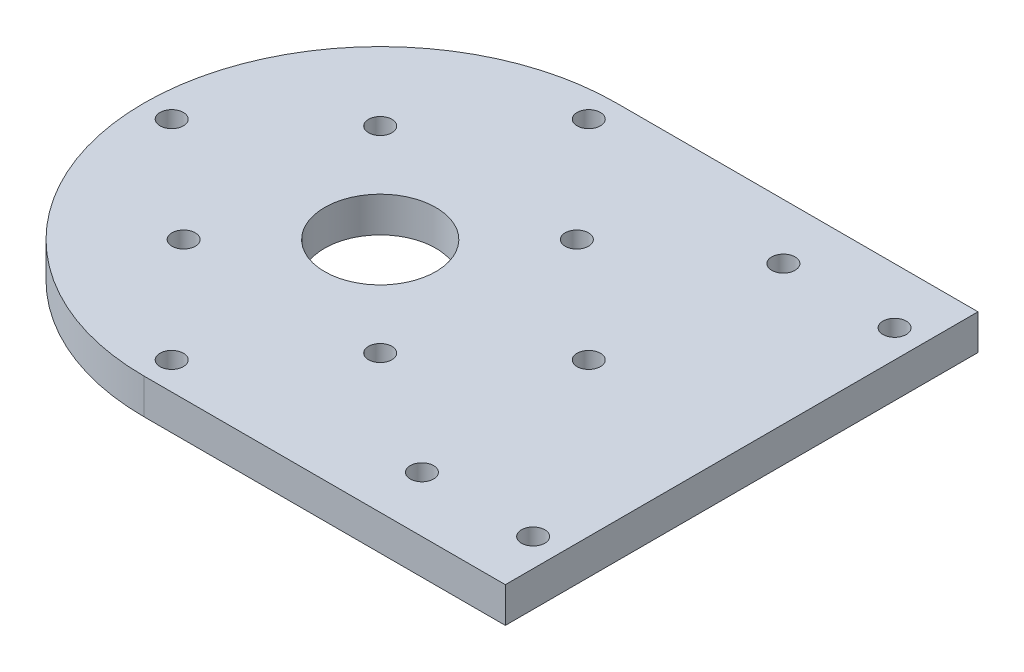
ISO-10303-21;
HEADER;
FILE_DESCRIPTION(('STEP AP214'),'2;1');
FILE_NAME('part.step','',(''),(''),'','','');
FILE_SCHEMA(('AUTOMOTIVE_DESIGN { 1 0 10303 214 1 1 1 1 }'));
ENDSEC;
DATA;
#1=APPLICATION_CONTEXT('core data for automotive mechanical design processes');
#2=APPLICATION_PROTOCOL_DEFINITION('international standard','automotive_design',2000,#1);
#3=PRODUCT_CONTEXT('',#1,'mechanical');
#4=PRODUCT('Part','Part','',(#3));
#5=PRODUCT_RELATED_PRODUCT_CATEGORY('part','',(#4));
#6=PRODUCT_DEFINITION_FORMATION('','',#4);
#7=PRODUCT_DEFINITION_CONTEXT('part definition',#1,'design');
#8=PRODUCT_DEFINITION('design','',#6,#7);
#9=PRODUCT_DEFINITION_SHAPE('','',#8);
#10=(LENGTH_UNIT() NAMED_UNIT(*) SI_UNIT(.MILLI.,.METRE.));
#11=(NAMED_UNIT(*) PLANE_ANGLE_UNIT() SI_UNIT($,.RADIAN.));
#12=(NAMED_UNIT(*) SI_UNIT($,.STERADIAN.) SOLID_ANGLE_UNIT());
#13=UNCERTAINTY_MEASURE_WITH_UNIT(LENGTH_MEASURE(1.E-05),#10,'distance_accuracy_value','');
#14=(GEOMETRIC_REPRESENTATION_CONTEXT(3) GLOBAL_UNCERTAINTY_ASSIGNED_CONTEXT((#13)) GLOBAL_UNIT_ASSIGNED_CONTEXT((#10,
#11,#12)) REPRESENTATION_CONTEXT('',''));
#15=CARTESIAN_POINT('',(0.,0.,0.));
#16=DIRECTION('',(0.,0.,1.));
#17=DIRECTION('',(1.,0.,0.));
#18=AXIS2_PLACEMENT_3D('',#15,#16,#17);
#19=CARTESIAN_POINT('',(0.,-6.35,0.));
#20=DIRECTION('',(0.,1.,0.));
#21=DIRECTION('',(0.,0.,1.));
#22=AXIS2_PLACEMENT_3D('',#19,#20,#21);
#23=CYLINDRICAL_SURFACE('',#22,42.5);
#24=CARTESIAN_POINT('',(0.,0.,0.));
#25=DIRECTION('',(0.,1.,0.));
#26=DIRECTION('',(0.,0.,1.));
#27=AXIS2_PLACEMENT_3D('',#24,#25,#26);
#28=CIRCLE('',#27,42.5);
#29=CARTESIAN_POINT('',(0.,0.,-42.5));
#30=VERTEX_POINT('',#29);
#31=CARTESIAN_POINT('',(0.,0.,42.5));
#32=VERTEX_POINT('',#31);
#33=EDGE_CURVE('E143',#30,#32,#28,.T.);
#34=ORIENTED_EDGE('',*,*,#33,.F.);
#35=DIRECTION('',(0.,1.,0.));
#36=VECTOR('',#35,1.);
#37=CARTESIAN_POINT('',(0.,-6.35,-42.5));
#38=LINE('',#37,#36);
#39=CARTESIAN_POINT('',(0.,-6.35,-42.5));
#40=VERTEX_POINT('',#39);
#41=EDGE_CURVE('E11',#40,#30,#38,.T.);
#42=ORIENTED_EDGE('',*,*,#41,.F.);
#43=CARTESIAN_POINT('',(0.,-6.35,0.));
#44=DIRECTION('',(0.,1.,0.));
#45=DIRECTION('',(0.,0.,1.));
#46=AXIS2_PLACEMENT_3D('',#43,#44,#45);
#47=CIRCLE('',#46,42.5);
#48=CARTESIAN_POINT('',(0.,-6.35,42.5));
#49=VERTEX_POINT('',#48);
#50=EDGE_CURVE('E97',#40,#49,#47,.T.);
#51=ORIENTED_EDGE('',*,*,#50,.T.);
#52=DIRECTION('',(0.,1.,0.));
#53=VECTOR('',#52,1.);
#54=CARTESIAN_POINT('',(0.,-6.35,42.5));
#55=LINE('',#54,#53);
#56=EDGE_CURVE('E39',#49,#32,#55,.T.);
#57=ORIENTED_EDGE('',*,*,#56,.T.);
#58=EDGE_LOOP('',(#34,#42,#51,#57));
#59=FACE_BOUND('',#58,.T.);
#60=ADVANCED_FACE('F35',(#59),#23,.T.);
#61=CARTESIAN_POINT('',(0.,-6.35,-42.5));
#62=DIRECTION('',(0.,0.,1.));
#63=DIRECTION('',(1.,0.,0.));
#64=AXIS2_PLACEMENT_3D('',#61,#62,#63);
#65=PLANE('',#64);
#66=DIRECTION('',(1.,0.,0.));
#67=VECTOR('',#66,1.);
#68=CARTESIAN_POINT('',(0.,0.,-42.5));
#69=LINE('',#68,#67);
#70=CARTESIAN_POINT('',(65.,0.,-42.5));
#71=VERTEX_POINT('',#70);
#72=EDGE_CURVE('E149',#30,#71,#69,.T.);
#73=ORIENTED_EDGE('',*,*,#72,.T.);
#74=DIRECTION('',(0.,1.,0.));
#75=VECTOR('',#74,1.);
#76=CARTESIAN_POINT('',(65.,-6.35,-42.5));
#77=LINE('',#76,#75);
#78=CARTESIAN_POINT('',(65.,-6.35,-42.5));
#79=VERTEX_POINT('',#78);
#80=EDGE_CURVE('E45',#79,#71,#77,.T.);
#81=ORIENTED_EDGE('',*,*,#80,.F.);
#82=DIRECTION('',(1.,0.,0.));
#83=VECTOR('',#82,1.);
#84=CARTESIAN_POINT('',(0.,-6.35,-42.5));
#85=LINE('',#84,#83);
#86=EDGE_CURVE('E90',#40,#79,#85,.T.);
#87=ORIENTED_EDGE('',*,*,#86,.F.);
#88=ORIENTED_EDGE('',*,*,#41,.T.);
#89=EDGE_LOOP('',(#73,#81,#87,#88));
#90=FACE_BOUND('',#89,.T.);
#91=ADVANCED_FACE('F164',(#90),#65,.F.);
#92=CARTESIAN_POINT('',(65.,-6.35,0.));
#93=DIRECTION('',(-1.,0.,0.));
#94=DIRECTION('',(0.,0.,1.));
#95=AXIS2_PLACEMENT_3D('',#92,#93,#94);
#96=PLANE('',#95);
#97=DIRECTION('',(0.,0.,1.));
#98=VECTOR('',#97,1.);
#99=CARTESIAN_POINT('',(65.,0.,0.));
#100=LINE('',#99,#98);
#101=CARTESIAN_POINT('',(65.,0.,42.5));
#102=VERTEX_POINT('',#101);
#103=EDGE_CURVE('E70',#71,#102,#100,.T.);
#104=ORIENTED_EDGE('',*,*,#103,.T.);
#105=DIRECTION('',(0.,1.,0.));
#106=VECTOR('',#105,1.);
#107=CARTESIAN_POINT('',(65.,-6.35,42.5));
#108=LINE('',#107,#106);
#109=CARTESIAN_POINT('',(65.,-6.35,42.5));
#110=VERTEX_POINT('',#109);
#111=EDGE_CURVE('E94',#110,#102,#108,.T.);
#112=ORIENTED_EDGE('',*,*,#111,.F.);
#113=DIRECTION('',(0.,0.,1.));
#114=VECTOR('',#113,1.);
#115=CARTESIAN_POINT('',(65.,-6.35,0.));
#116=LINE('',#115,#114);
#117=EDGE_CURVE('E84',#79,#110,#116,.T.);
#118=ORIENTED_EDGE('',*,*,#117,.F.);
#119=ORIENTED_EDGE('',*,*,#80,.T.);
#120=EDGE_LOOP('',(#104,#112,#118,#119));
#121=FACE_BOUND('',#120,.T.);
#122=ADVANCED_FACE('F95',(#121),#96,.F.);
#123=CARTESIAN_POINT('',(60.,-6.35,-32.5));
#124=DIRECTION('',(0.,1.,0.));
#125=DIRECTION('',(0.,0.,1.));
#126=AXIS2_PLACEMENT_3D('',#123,#124,#125);
#127=CYLINDRICAL_SURFACE('',#126,2.10000000000001);
#128=CARTESIAN_POINT('',(60.,-6.35,-32.5));
#129=DIRECTION('',(0.,1.,0.));
#130=DIRECTION('',(0.,0.,1.));
#131=AXIS2_PLACEMENT_3D('',#128,#129,#130);
#132=CIRCLE('',#131,2.10000000000001);
#133=CARTESIAN_POINT('',(60.,-6.35,-30.4));
#134=VERTEX_POINT('',#133);
#135=EDGE_CURVE('E110',#134,#134,#132,.T.);
#136=ORIENTED_EDGE('',*,*,#135,.F.);
#137=EDGE_LOOP('',(#136));
#138=FACE_BOUND('',#137,.T.);
#139=CARTESIAN_POINT('',(60.,0.,-32.5));
#140=DIRECTION('',(0.,1.,0.));
#141=DIRECTION('',(0.,0.,1.));
#142=AXIS2_PLACEMENT_3D('',#139,#140,#141);
#143=CIRCLE('',#142,2.10000000000001);
#144=CARTESIAN_POINT('',(60.,0.,-30.4));
#145=VERTEX_POINT('',#144);
#146=EDGE_CURVE('E157',#145,#145,#143,.T.);
#147=ORIENTED_EDGE('',*,*,#146,.T.);
#148=EDGE_LOOP('',(#147));
#149=FACE_BOUND('',#148,.T.);
#150=ADVANCED_FACE('F251',(#138,#149),#127,.F.);
#151=CARTESIAN_POINT('',(40.,-6.35,32.5));
#152=DIRECTION('',(0.,1.,0.));
#153=DIRECTION('',(0.,0.,1.));
#154=AXIS2_PLACEMENT_3D('',#151,#152,#153);
#155=CYLINDRICAL_SURFACE('',#154,2.1);
#156=CARTESIAN_POINT('',(40.,-6.35,32.5));
#157=DIRECTION('',(0.,1.,0.));
#158=DIRECTION('',(0.,0.,1.));
#159=AXIS2_PLACEMENT_3D('',#156,#157,#158);
#160=CIRCLE('',#159,2.1);
#161=CARTESIAN_POINT('',(40.,-6.35,34.6));
#162=VERTEX_POINT('',#161);
#163=EDGE_CURVE('E107',#162,#162,#160,.T.);
#164=ORIENTED_EDGE('',*,*,#163,.F.);
#165=EDGE_LOOP('',(#164));
#166=FACE_BOUND('',#165,.T.);
#167=CARTESIAN_POINT('',(40.,0.,32.5));
#168=DIRECTION('',(0.,1.,0.));
#169=DIRECTION('',(0.,0.,1.));
#170=AXIS2_PLACEMENT_3D('',#167,#168,#169);
#171=CIRCLE('',#170,2.1);
#172=CARTESIAN_POINT('',(40.,0.,34.6));
#173=VERTEX_POINT('',#172);
#174=EDGE_CURVE('E154',#173,#173,#171,.T.);
#175=ORIENTED_EDGE('',*,*,#174,.T.);
#176=EDGE_LOOP('',(#175));
#177=FACE_BOUND('',#176,.T.);
#178=ADVANCED_FACE('F254',(#166,#177),#155,.F.);
#179=CARTESIAN_POINT('',(60.,-6.35,32.5));
#180=DIRECTION('',(0.,1.,0.));
#181=DIRECTION('',(0.,0.,1.));
#182=AXIS2_PLACEMENT_3D('',#179,#180,#181);
#183=CYLINDRICAL_SURFACE('',#182,2.1);
#184=CARTESIAN_POINT('',(60.,-6.35,32.5));
#185=DIRECTION('',(0.,1.,0.));
#186=DIRECTION('',(0.,0.,1.));
#187=AXIS2_PLACEMENT_3D('',#184,#185,#186);
#188=CIRCLE('',#187,2.1);
#189=CARTESIAN_POINT('',(60.,-6.35,34.6));
#190=VERTEX_POINT('',#189);
#191=EDGE_CURVE('E104',#190,#190,#188,.T.);
#192=ORIENTED_EDGE('',*,*,#191,.F.);
#193=EDGE_LOOP('',(#192));
#194=FACE_BOUND('',#193,.T.);
#195=CARTESIAN_POINT('',(60.,0.,32.5));
#196=DIRECTION('',(0.,1.,0.));
#197=DIRECTION('',(0.,0.,1.));
#198=AXIS2_PLACEMENT_3D('',#195,#196,#197);
#199=CIRCLE('',#198,2.1);
#200=CARTESIAN_POINT('',(60.,0.,34.6));
#201=VERTEX_POINT('',#200);
#202=EDGE_CURVE('E151',#201,#201,#199,.T.);
#203=ORIENTED_EDGE('',*,*,#202,.T.);
#204=EDGE_LOOP('',(#203));
#205=FACE_BOUND('',#204,.T.);
#206=ADVANCED_FACE('F258',(#194,#205),#183,.F.);
#207=CARTESIAN_POINT('',(0.,-6.35,42.5));
#208=DIRECTION('',(0.,0.,1.));
#209=DIRECTION('',(1.,0.,0.));
#210=AXIS2_PLACEMENT_3D('',#207,#208,#209);
#211=PLANE('',#210);
#212=DIRECTION('',(1.,0.,0.));
#213=VECTOR('',#212,1.);
#214=CARTESIAN_POINT('',(0.,0.,42.5));
#215=LINE('',#214,#213);
#216=EDGE_CURVE('E146',#32,#102,#215,.T.);
#217=ORIENTED_EDGE('',*,*,#216,.F.);
#218=ORIENTED_EDGE('',*,*,#56,.F.);
#219=DIRECTION('',(1.,0.,0.));
#220=VECTOR('',#219,1.);
#221=CARTESIAN_POINT('',(0.,-6.35,42.5));
#222=LINE('',#221,#220);
#223=EDGE_CURVE('E89',#49,#110,#222,.T.);
#224=ORIENTED_EDGE('',*,*,#223,.T.);
#225=ORIENTED_EDGE('',*,*,#111,.T.);
#226=EDGE_LOOP('',(#217,#218,#224,#225));
#227=FACE_BOUND('',#226,.T.);
#228=ADVANCED_FACE('F96',(#227),#211,.T.);
#229=CARTESIAN_POINT('',(0.,-6.35,0.));
#230=DIRECTION('',(0.,1.,0.));
#231=DIRECTION('',(0.,0.,1.));
#232=AXIS2_PLACEMENT_3D('',#229,#230,#231);
#233=CYLINDRICAL_SURFACE('',#232,9.99999999999998);
#234=CARTESIAN_POINT('',(0.,-6.35,0.));
#235=DIRECTION('',(0.,1.,0.));
#236=DIRECTION('',(0.,0.,1.));
#237=AXIS2_PLACEMENT_3D('',#234,#235,#236);
#238=CIRCLE('',#237,9.99999999999998);
#239=CARTESIAN_POINT('',(0.,-6.35,9.99999999999998));
#240=VERTEX_POINT('',#239);
#241=EDGE_CURVE('E99',#240,#240,#238,.T.);
#242=ORIENTED_EDGE('',*,*,#241,.F.);
#243=EDGE_LOOP('',(#242));
#244=FACE_BOUND('',#243,.T.);
#245=CARTESIAN_POINT('',(0.,0.,0.));
#246=DIRECTION('',(0.,1.,0.));
#247=DIRECTION('',(0.,0.,1.));
#248=AXIS2_PLACEMENT_3D('',#245,#246,#247);
#249=CIRCLE('',#248,9.99999999999998);
#250=CARTESIAN_POINT('',(0.,0.,9.99999999999998));
#251=VERTEX_POINT('',#250);
#252=EDGE_CURVE('E140',#251,#251,#249,.T.);
#253=ORIENTED_EDGE('',*,*,#252,.T.);
#254=EDGE_LOOP('',(#253));
#255=FACE_BOUND('',#254,.T.);
#256=ADVANCED_FACE('F176',(#244,#255),#233,.F.);
#257=CARTESIAN_POINT('',(-37.5,-6.35,0.));
#258=DIRECTION('',(0.,1.,0.));
#259=DIRECTION('',(0.,0.,1.));
#260=AXIS2_PLACEMENT_3D('',#257,#258,#259);
#261=CYLINDRICAL_SURFACE('',#260,2.09999999999999);
#262=CARTESIAN_POINT('',(-37.5,-6.35,0.));
#263=DIRECTION('',(0.,1.,0.));
#264=DIRECTION('',(0.,0.,1.));
#265=AXIS2_PLACEMENT_3D('',#262,#263,#264);
#266=CIRCLE('',#265,2.09999999999999);
#267=CARTESIAN_POINT('',(-37.5,-6.35,2.09999999999999));
#268=VERTEX_POINT('',#267);
#269=EDGE_CURVE('E430',#268,#268,#266,.T.);
#270=ORIENTED_EDGE('',*,*,#269,.F.);
#271=EDGE_LOOP('',(#270));
#272=FACE_BOUND('',#271,.T.);
#273=CARTESIAN_POINT('',(-37.5,0.,0.));
#274=DIRECTION('',(0.,1.,0.));
#275=DIRECTION('',(0.,0.,1.));
#276=AXIS2_PLACEMENT_3D('',#273,#274,#275);
#277=CIRCLE('',#276,2.09999999999999);
#278=CARTESIAN_POINT('',(-37.5,0.,2.09999999999999));
#279=VERTEX_POINT('',#278);
#280=EDGE_CURVE('E137',#279,#279,#277,.T.);
#281=ORIENTED_EDGE('',*,*,#280,.T.);
#282=EDGE_LOOP('',(#281));
#283=FACE_BOUND('',#282,.T.);
#284=ADVANCED_FACE('F179',(#272,#283),#261,.F.);
#285=CARTESIAN_POINT('',(0.,-6.35,-37.5));
#286=DIRECTION('',(0.,1.,0.));
#287=DIRECTION('',(0.,0.,1.));
#288=AXIS2_PLACEMENT_3D('',#285,#286,#287);
#289=CYLINDRICAL_SURFACE('',#288,2.09999999999999);
#290=CARTESIAN_POINT('',(0.,-6.35,-37.5));
#291=DIRECTION('',(0.,1.,0.));
#292=DIRECTION('',(0.,0.,1.));
#293=AXIS2_PLACEMENT_3D('',#290,#291,#292);
#294=CIRCLE('',#293,2.09999999999999);
#295=CARTESIAN_POINT('',(0.,-6.35,-35.4));
#296=VERTEX_POINT('',#295);
#297=EDGE_CURVE('E426',#296,#296,#294,.T.);
#298=ORIENTED_EDGE('',*,*,#297,.F.);
#299=EDGE_LOOP('',(#298));
#300=FACE_BOUND('',#299,.T.);
#301=CARTESIAN_POINT('',(0.,0.,-37.5));
#302=DIRECTION('',(0.,1.,0.));
#303=DIRECTION('',(0.,0.,1.));
#304=AXIS2_PLACEMENT_3D('',#301,#302,#303);
#305=CIRCLE('',#304,2.09999999999999);
#306=CARTESIAN_POINT('',(0.,0.,-35.4));
#307=VERTEX_POINT('',#306);
#308=EDGE_CURVE('E134',#307,#307,#305,.T.);
#309=ORIENTED_EDGE('',*,*,#308,.T.);
#310=EDGE_LOOP('',(#309));
#311=FACE_BOUND('',#310,.T.);
#312=ADVANCED_FACE('F183',(#300,#311),#289,.F.);
#313=CARTESIAN_POINT('',(0.,-6.35,37.5));
#314=DIRECTION('',(0.,1.,0.));
#315=DIRECTION('',(0.,0.,1.));
#316=AXIS2_PLACEMENT_3D('',#313,#314,#315);
#317=CYLINDRICAL_SURFACE('',#316,2.09999999999999);
#318=CARTESIAN_POINT('',(0.,-6.35,37.5));
#319=DIRECTION('',(0.,1.,0.));
#320=DIRECTION('',(0.,0.,1.));
#321=AXIS2_PLACEMENT_3D('',#318,#319,#320);
#322=CIRCLE('',#321,2.09999999999999);
#323=CARTESIAN_POINT('',(0.,-6.35,39.6));
#324=VERTEX_POINT('',#323);
#325=EDGE_CURVE('E422',#324,#324,#322,.T.);
#326=ORIENTED_EDGE('',*,*,#325,.F.);
#327=EDGE_LOOP('',(#326));
#328=FACE_BOUND('',#327,.T.);
#329=CARTESIAN_POINT('',(0.,0.,37.5));
#330=DIRECTION('',(0.,1.,0.));
#331=DIRECTION('',(0.,0.,1.));
#332=AXIS2_PLACEMENT_3D('',#329,#330,#331);
#333=CIRCLE('',#332,2.09999999999999);
#334=CARTESIAN_POINT('',(0.,0.,39.6));
#335=VERTEX_POINT('',#334);
#336=EDGE_CURVE('E131',#335,#335,#333,.T.);
#337=ORIENTED_EDGE('',*,*,#336,.T.);
#338=EDGE_LOOP('',(#337));
#339=FACE_BOUND('',#338,.T.);
#340=ADVANCED_FACE('F187',(#328,#339),#317,.F.);
#341=CARTESIAN_POINT('',(37.5,-6.35,0.));
#342=DIRECTION('',(0.,1.,0.));
#343=DIRECTION('',(0.,0.,1.));
#344=AXIS2_PLACEMENT_3D('',#341,#342,#343);
#345=CYLINDRICAL_SURFACE('',#344,2.1);
#346=CARTESIAN_POINT('',(37.5,-6.35,0.));
#347=DIRECTION('',(0.,1.,0.));
#348=DIRECTION('',(0.,0.,1.));
#349=AXIS2_PLACEMENT_3D('',#346,#347,#348);
#350=CIRCLE('',#349,2.1);
#351=CARTESIAN_POINT('',(37.5,-6.35,2.1));
#352=VERTEX_POINT('',#351);
#353=EDGE_CURVE('E418',#352,#352,#350,.T.);
#354=ORIENTED_EDGE('',*,*,#353,.F.);
#355=EDGE_LOOP('',(#354));
#356=FACE_BOUND('',#355,.T.);
#357=CARTESIAN_POINT('',(37.5,0.,0.));
#358=DIRECTION('',(0.,1.,0.));
#359=DIRECTION('',(0.,0.,1.));
#360=AXIS2_PLACEMENT_3D('',#357,#358,#359);
#361=CIRCLE('',#360,2.1);
#362=CARTESIAN_POINT('',(37.5,0.,2.1));
#363=VERTEX_POINT('',#362);
#364=EDGE_CURVE('E128',#363,#363,#361,.T.);
#365=ORIENTED_EDGE('',*,*,#364,.T.);
#366=EDGE_LOOP('',(#365));
#367=FACE_BOUND('',#366,.T.);
#368=ADVANCED_FACE('F191',(#356,#367),#345,.F.);
#369=CARTESIAN_POINT('',(-17.6776695296638,-6.35,17.6776695296636));
#370=DIRECTION('',(0.,1.,0.));
#371=DIRECTION('',(0.,0.,1.));
#372=AXIS2_PLACEMENT_3D('',#369,#370,#371);
#373=CYLINDRICAL_SURFACE('',#372,2.1);
#374=CARTESIAN_POINT('',(-17.6776695296638,-6.35,17.6776695296636));
#375=DIRECTION('',(0.,1.,0.));
#376=DIRECTION('',(0.,0.,1.));
#377=AXIS2_PLACEMENT_3D('',#374,#375,#376);
#378=CIRCLE('',#377,2.1);
#379=CARTESIAN_POINT('',(-17.6776695296638,-6.35,19.7776695296636));
#380=VERTEX_POINT('',#379);
#381=EDGE_CURVE('E414',#380,#380,#378,.T.);
#382=ORIENTED_EDGE('',*,*,#381,.F.);
#383=EDGE_LOOP('',(#382));
#384=FACE_BOUND('',#383,.T.);
#385=CARTESIAN_POINT('',(-17.6776695296638,0.,17.6776695296636));
#386=DIRECTION('',(0.,1.,0.));
#387=DIRECTION('',(0.,0.,1.));
#388=AXIS2_PLACEMENT_3D('',#385,#386,#387);
#389=CIRCLE('',#388,2.1);
#390=CARTESIAN_POINT('',(-17.6776695296638,0.,19.7776695296636));
#391=VERTEX_POINT('',#390);
#392=EDGE_CURVE('E125',#391,#391,#389,.T.);
#393=ORIENTED_EDGE('',*,*,#392,.T.);
#394=EDGE_LOOP('',(#393));
#395=FACE_BOUND('',#394,.T.);
#396=ADVANCED_FACE('F195',(#384,#395),#373,.F.);
#397=CARTESIAN_POINT('',(-17.6776695296636,-6.35,-17.6776695296638));
#398=DIRECTION('',(0.,1.,0.));
#399=DIRECTION('',(0.,0.,1.));
#400=AXIS2_PLACEMENT_3D('',#397,#398,#399);
#401=CYLINDRICAL_SURFACE('',#400,2.1);
#402=CARTESIAN_POINT('',(-17.6776695296636,-6.35,-17.6776695296638));
#403=DIRECTION('',(0.,1.,0.));
#404=DIRECTION('',(0.,0.,1.));
#405=AXIS2_PLACEMENT_3D('',#402,#403,#404);
#406=CIRCLE('',#405,2.1);
#407=CARTESIAN_POINT('',(-17.6776695296636,-6.35,-15.5776695296638));
#408=VERTEX_POINT('',#407);
#409=EDGE_CURVE('E410',#408,#408,#406,.T.);
#410=ORIENTED_EDGE('',*,*,#409,.F.);
#411=EDGE_LOOP('',(#410));
#412=FACE_BOUND('',#411,.T.);
#413=CARTESIAN_POINT('',(-17.6776695296636,0.,-17.6776695296638));
#414=DIRECTION('',(0.,1.,0.));
#415=DIRECTION('',(0.,0.,1.));
#416=AXIS2_PLACEMENT_3D('',#413,#414,#415);
#417=CIRCLE('',#416,2.1);
#418=CARTESIAN_POINT('',(-17.6776695296636,0.,-15.5776695296638));
#419=VERTEX_POINT('',#418);
#420=EDGE_CURVE('E122',#419,#419,#417,.T.);
#421=ORIENTED_EDGE('',*,*,#420,.T.);
#422=EDGE_LOOP('',(#421));
#423=FACE_BOUND('',#422,.T.);
#424=ADVANCED_FACE('F199',(#412,#423),#401,.F.);
#425=CARTESIAN_POINT('',(17.6776695296638,-6.35,-17.6776695296636));
#426=DIRECTION('',(0.,1.,0.));
#427=DIRECTION('',(0.,0.,1.));
#428=AXIS2_PLACEMENT_3D('',#425,#426,#427);
#429=CYLINDRICAL_SURFACE('',#428,2.1);
#430=CARTESIAN_POINT('',(17.6776695296638,-6.35,-17.6776695296636));
#431=DIRECTION('',(0.,1.,0.));
#432=DIRECTION('',(0.,0.,1.));
#433=AXIS2_PLACEMENT_3D('',#430,#431,#432);
#434=CIRCLE('',#433,2.1);
#435=CARTESIAN_POINT('',(17.6776695296638,-6.35,-15.5776695296636));
#436=VERTEX_POINT('',#435);
#437=EDGE_CURVE('E214',#436,#436,#434,.T.);
#438=ORIENTED_EDGE('',*,*,#437,.F.);
#439=EDGE_LOOP('',(#438));
#440=FACE_BOUND('',#439,.T.);
#441=CARTESIAN_POINT('',(17.6776695296638,0.,-17.6776695296636));
#442=DIRECTION('',(0.,1.,0.));
#443=DIRECTION('',(0.,0.,1.));
#444=AXIS2_PLACEMENT_3D('',#441,#442,#443);
#445=CIRCLE('',#444,2.1);
#446=CARTESIAN_POINT('',(17.6776695296638,0.,-15.5776695296636));
#447=VERTEX_POINT('',#446);
#448=EDGE_CURVE('E119',#447,#447,#445,.T.);
#449=ORIENTED_EDGE('',*,*,#448,.T.);
#450=EDGE_LOOP('',(#449));
#451=FACE_BOUND('',#450,.T.);
#452=ADVANCED_FACE('F202',(#440,#451),#429,.F.);
#453=CARTESIAN_POINT('',(17.6776695296636,-6.35,17.6776695296638));
#454=DIRECTION('',(0.,1.,0.));
#455=DIRECTION('',(0.,0.,1.));
#456=AXIS2_PLACEMENT_3D('',#453,#454,#455);
#457=CYLINDRICAL_SURFACE('',#456,2.1);
#458=CARTESIAN_POINT('',(17.6776695296636,-6.35,17.6776695296638));
#459=DIRECTION('',(0.,1.,0.));
#460=DIRECTION('',(0.,0.,1.));
#461=AXIS2_PLACEMENT_3D('',#458,#459,#460);
#462=CIRCLE('',#461,2.1);
#463=CARTESIAN_POINT('',(17.6776695296636,-6.35,19.7776695296638));
#464=VERTEX_POINT('',#463);
#465=EDGE_CURVE('E162',#464,#464,#462,.T.);
#466=ORIENTED_EDGE('',*,*,#465,.F.);
#467=EDGE_LOOP('',(#466));
#468=FACE_BOUND('',#467,.T.);
#469=CARTESIAN_POINT('',(17.6776695296636,0.,17.6776695296638));
#470=DIRECTION('',(0.,1.,0.));
#471=DIRECTION('',(0.,0.,1.));
#472=AXIS2_PLACEMENT_3D('',#469,#470,#471);
#473=CIRCLE('',#472,2.1);
#474=CARTESIAN_POINT('',(17.6776695296636,0.,19.7776695296638));
#475=VERTEX_POINT('',#474);
#476=EDGE_CURVE('E116',#475,#475,#473,.T.);
#477=ORIENTED_EDGE('',*,*,#476,.T.);
#478=EDGE_LOOP('',(#477));
#479=FACE_BOUND('',#478,.T.);
#480=ADVANCED_FACE('F37',(#468,#479),#457,.F.);
#481=CARTESIAN_POINT('',(40.,-6.35,-32.5));
#482=DIRECTION('',(0.,1.,0.));
#483=DIRECTION('',(0.,0.,1.));
#484=AXIS2_PLACEMENT_3D('',#481,#482,#483);
#485=CYLINDRICAL_SURFACE('',#484,2.1);
#486=CARTESIAN_POINT('',(40.,-6.35,-32.5));
#487=DIRECTION('',(0.,1.,0.));
#488=DIRECTION('',(0.,0.,1.));
#489=AXIS2_PLACEMENT_3D('',#486,#487,#488);
#490=CIRCLE('',#489,2.1);
#491=CARTESIAN_POINT('',(40.,-6.35,-30.4));
#492=VERTEX_POINT('',#491);
#493=EDGE_CURVE('E113',#492,#492,#490,.T.);
#494=ORIENTED_EDGE('',*,*,#493,.F.);
#495=EDGE_LOOP('',(#494));
#496=FACE_BOUND('',#495,.T.);
#497=CARTESIAN_POINT('',(40.,0.,-32.5));
#498=DIRECTION('',(0.,1.,0.));
#499=DIRECTION('',(0.,0.,1.));
#500=AXIS2_PLACEMENT_3D('',#497,#498,#499);
#501=CIRCLE('',#500,2.1);
#502=CARTESIAN_POINT('',(40.,0.,-30.4));
#503=VERTEX_POINT('',#502);
#504=EDGE_CURVE('E160',#503,#503,#501,.T.);
#505=ORIENTED_EDGE('',*,*,#504,.T.);
#506=EDGE_LOOP('',(#505));
#507=FACE_BOUND('',#506,.T.);
#508=ADVANCED_FACE('F209',(#496,#507),#485,.F.);
#509=CARTESIAN_POINT('',(0.,-6.35,0.));
#510=DIRECTION('',(0.,1.,0.));
#511=DIRECTION('',(0.,0.,1.));
#512=AXIS2_PLACEMENT_3D('',#509,#510,#511);
#513=PLANE('',#512);
#514=ORIENTED_EDGE('',*,*,#465,.T.);
#515=EDGE_LOOP('',(#514));
#516=FACE_BOUND('',#515,.T.);
#517=ORIENTED_EDGE('',*,*,#437,.T.);
#518=EDGE_LOOP('',(#517));
#519=FACE_BOUND('',#518,.T.);
#520=ORIENTED_EDGE('',*,*,#409,.T.);
#521=EDGE_LOOP('',(#520));
#522=FACE_BOUND('',#521,.T.);
#523=ORIENTED_EDGE('',*,*,#381,.T.);
#524=EDGE_LOOP('',(#523));
#525=FACE_BOUND('',#524,.T.);
#526=ORIENTED_EDGE('',*,*,#353,.T.);
#527=EDGE_LOOP('',(#526));
#528=FACE_BOUND('',#527,.T.);
#529=ORIENTED_EDGE('',*,*,#325,.T.);
#530=EDGE_LOOP('',(#529));
#531=FACE_BOUND('',#530,.T.);
#532=ORIENTED_EDGE('',*,*,#297,.T.);
#533=EDGE_LOOP('',(#532));
#534=FACE_BOUND('',#533,.T.);
#535=ORIENTED_EDGE('',*,*,#269,.T.);
#536=EDGE_LOOP('',(#535));
#537=FACE_BOUND('',#536,.T.);
#538=ORIENTED_EDGE('',*,*,#241,.T.);
#539=EDGE_LOOP('',(#538));
#540=FACE_BOUND('',#539,.T.);
#541=ORIENTED_EDGE('',*,*,#50,.F.);
#542=ORIENTED_EDGE('',*,*,#86,.T.);
#543=ORIENTED_EDGE('',*,*,#117,.T.);
#544=ORIENTED_EDGE('',*,*,#223,.F.);
#545=EDGE_LOOP('',(#541,#542,#543,#544));
#546=FACE_BOUND('',#545,.T.);
#547=ORIENTED_EDGE('',*,*,#191,.T.);
#548=EDGE_LOOP('',(#547));
#549=FACE_BOUND('',#548,.T.);
#550=ORIENTED_EDGE('',*,*,#163,.T.);
#551=EDGE_LOOP('',(#550));
#552=FACE_BOUND('',#551,.T.);
#553=ORIENTED_EDGE('',*,*,#135,.T.);
#554=EDGE_LOOP('',(#553));
#555=FACE_BOUND('',#554,.T.);
#556=ORIENTED_EDGE('',*,*,#493,.T.);
#557=EDGE_LOOP('',(#556));
#558=FACE_BOUND('',#557,.T.);
#559=ADVANCED_FACE('F87',(#516,#519,#522,#525,#528,#531,#534,#537,#540,#546,#549,#552,#555,
#558),#513,.F.);
#560=CARTESIAN_POINT('',(0.,0.,0.));
#561=DIRECTION('',(0.,1.,0.));
#562=DIRECTION('',(0.,0.,1.));
#563=AXIS2_PLACEMENT_3D('',#560,#561,#562);
#564=PLANE('',#563);
#565=ORIENTED_EDGE('',*,*,#476,.F.);
#566=EDGE_LOOP('',(#565));
#567=FACE_BOUND('',#566,.T.);
#568=ORIENTED_EDGE('',*,*,#448,.F.);
#569=EDGE_LOOP('',(#568));
#570=FACE_BOUND('',#569,.T.);
#571=ORIENTED_EDGE('',*,*,#420,.F.);
#572=EDGE_LOOP('',(#571));
#573=FACE_BOUND('',#572,.T.);
#574=ORIENTED_EDGE('',*,*,#392,.F.);
#575=EDGE_LOOP('',(#574));
#576=FACE_BOUND('',#575,.T.);
#577=ORIENTED_EDGE('',*,*,#364,.F.);
#578=EDGE_LOOP('',(#577));
#579=FACE_BOUND('',#578,.T.);
#580=ORIENTED_EDGE('',*,*,#336,.F.);
#581=EDGE_LOOP('',(#580));
#582=FACE_BOUND('',#581,.T.);
#583=ORIENTED_EDGE('',*,*,#308,.F.);
#584=EDGE_LOOP('',(#583));
#585=FACE_BOUND('',#584,.T.);
#586=ORIENTED_EDGE('',*,*,#280,.F.);
#587=EDGE_LOOP('',(#586));
#588=FACE_BOUND('',#587,.T.);
#589=ORIENTED_EDGE('',*,*,#252,.F.);
#590=EDGE_LOOP('',(#589));
#591=FACE_BOUND('',#590,.T.);
#592=ORIENTED_EDGE('',*,*,#33,.T.);
#593=ORIENTED_EDGE('',*,*,#216,.T.);
#594=ORIENTED_EDGE('',*,*,#103,.F.);
#595=ORIENTED_EDGE('',*,*,#72,.F.);
#596=EDGE_LOOP('',(#592,#593,#594,#595));
#597=FACE_BOUND('',#596,.T.);
#598=ORIENTED_EDGE('',*,*,#202,.F.);
#599=EDGE_LOOP('',(#598));
#600=FACE_BOUND('',#599,.T.);
#601=ORIENTED_EDGE('',*,*,#174,.F.);
#602=EDGE_LOOP('',(#601));
#603=FACE_BOUND('',#602,.T.);
#604=ORIENTED_EDGE('',*,*,#146,.F.);
#605=EDGE_LOOP('',(#604));
#606=FACE_BOUND('',#605,.T.);
#607=ORIENTED_EDGE('',*,*,#504,.F.);
#608=EDGE_LOOP('',(#607));
#609=FACE_BOUND('',#608,.T.);
#610=ADVANCED_FACE('F165',(#567,#570,#573,#576,#579,#582,#585,#588,#591,#597,#600,#603,#606,
#609),#564,.T.);
#611=CLOSED_SHELL('',(#60,#91,#122,#150,#178,#206,#228,#256,#284,#312,#340,#368,#396,#424,#452,
#480,#508,#559,#610));
#612=MANIFOLD_SOLID_BREP('B2',#611);
#613=ADVANCED_BREP_SHAPE_REPRESENTATION('',(#18,#612),#14);
#614=SHAPE_DEFINITION_REPRESENTATION(#9,#613);
ENDSEC;
END-ISO-10303-21;
